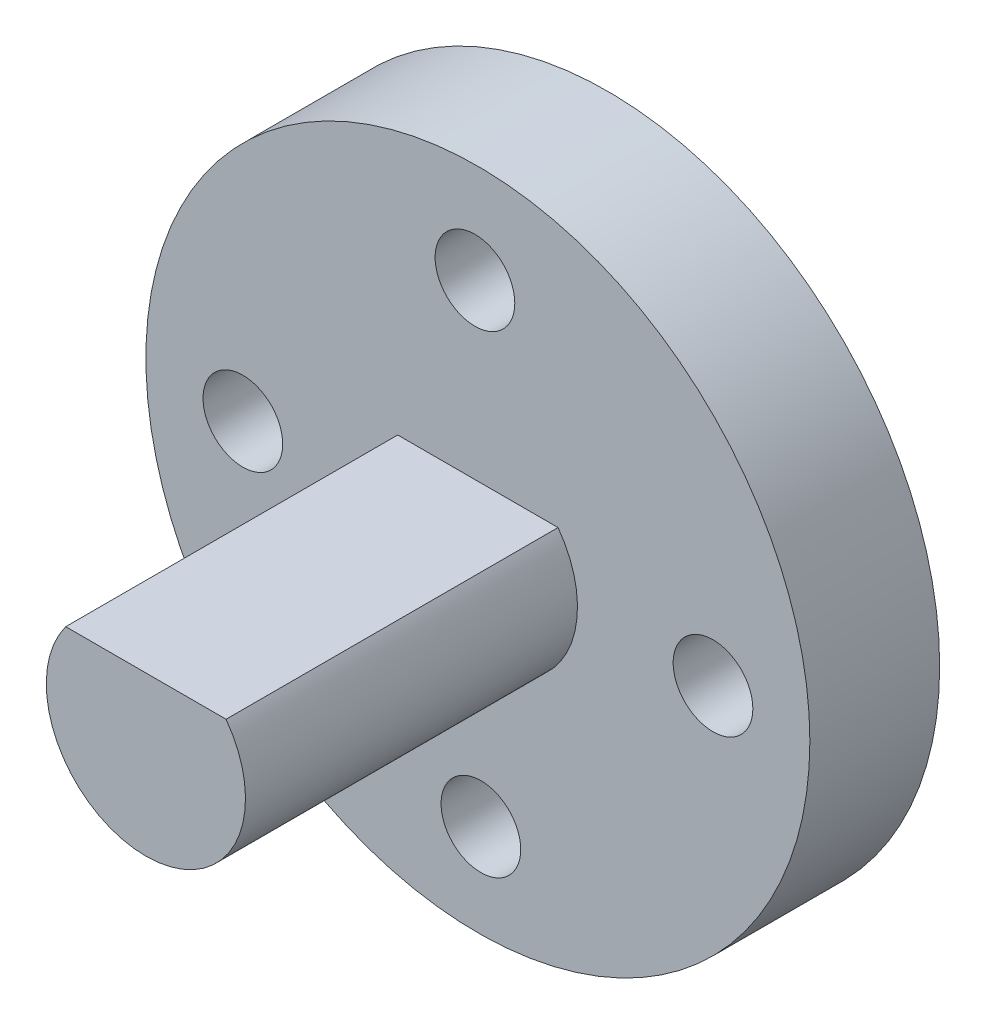
ISO-10303-21;
HEADER;
FILE_DESCRIPTION(('STEP AP214'),'2;1');
FILE_NAME('part.step','',(''),(''),'','','');
FILE_SCHEMA(('AUTOMOTIVE_DESIGN { 1 0 10303 214 1 1 1 1 }'));
ENDSEC;
DATA;
#1=APPLICATION_CONTEXT('core data for automotive mechanical design processes');
#2=APPLICATION_PROTOCOL_DEFINITION('international standard','automotive_design',2000,#1);
#3=PRODUCT_CONTEXT('',#1,'mechanical');
#4=PRODUCT('Part','Part','',(#3));
#5=PRODUCT_RELATED_PRODUCT_CATEGORY('part','',(#4));
#6=PRODUCT_DEFINITION_FORMATION('','',#4);
#7=PRODUCT_DEFINITION_CONTEXT('part definition',#1,'design');
#8=PRODUCT_DEFINITION('design','',#6,#7);
#9=PRODUCT_DEFINITION_SHAPE('','',#8);
#10=(LENGTH_UNIT() NAMED_UNIT(*) SI_UNIT(.MILLI.,.METRE.));
#11=(NAMED_UNIT(*) PLANE_ANGLE_UNIT() SI_UNIT($,.RADIAN.));
#12=(NAMED_UNIT(*) SI_UNIT($,.STERADIAN.) SOLID_ANGLE_UNIT());
#13=UNCERTAINTY_MEASURE_WITH_UNIT(LENGTH_MEASURE(1.E-05),#10,'distance_accuracy_value','');
#14=(GEOMETRIC_REPRESENTATION_CONTEXT(3) GLOBAL_UNCERTAINTY_ASSIGNED_CONTEXT((#13)) GLOBAL_UNIT_ASSIGNED_CONTEXT((#10,
#11,#12)) REPRESENTATION_CONTEXT('',''));
#15=CARTESIAN_POINT('',(0.,0.,0.));
#16=DIRECTION('',(0.,0.,1.));
#17=DIRECTION('',(1.,0.,0.));
#18=AXIS2_PLACEMENT_3D('',#15,#16,#17);
#19=CARTESIAN_POINT('',(0.,0.,3.91));
#20=DIRECTION('',(0.,0.,-1.));
#21=DIRECTION('',(-1.,0.,0.));
#22=AXIS2_PLACEMENT_3D('',#19,#20,#21);
#23=CYLINDRICAL_SURFACE('',#22,10.);
#24=CARTESIAN_POINT('',(0.,0.,3.91));
#25=DIRECTION('',(0.,0.,1.));
#26=DIRECTION('',(1.,0.,0.));
#27=AXIS2_PLACEMENT_3D('',#24,#25,#26);
#28=CIRCLE('',#27,10.);
#29=CARTESIAN_POINT('',(10.,0.,3.91));
#30=VERTEX_POINT('',#29);
#31=EDGE_CURVE('E42',#30,#30,#28,.T.);
#32=ORIENTED_EDGE('',*,*,#31,.F.);
#33=EDGE_LOOP('',(#32));
#34=FACE_BOUND('',#33,.T.);
#35=CARTESIAN_POINT('',(0.,0.,0.));
#36=DIRECTION('',(0.,0.,1.));
#37=DIRECTION('',(1.,0.,0.));
#38=AXIS2_PLACEMENT_3D('',#35,#36,#37);
#39=CIRCLE('',#38,10.);
#40=CARTESIAN_POINT('',(10.,0.,0.));
#41=VERTEX_POINT('',#40);
#42=EDGE_CURVE('E102',#41,#41,#39,.T.);
#43=ORIENTED_EDGE('',*,*,#42,.T.);
#44=EDGE_LOOP('',(#43));
#45=FACE_BOUND('',#44,.T.);
#46=ADVANCED_FACE('F35',(#34,#45),#23,.T.);
#47=CARTESIAN_POINT('',(0.,0.,3.91));
#48=DIRECTION('',(0.,0.,1.));
#49=DIRECTION('',(1.,0.,0.));
#50=AXIS2_PLACEMENT_3D('',#47,#48,#49);
#51=PLANE('',#50);
#52=CARTESIAN_POINT('',(0.,0.,3.91));
#53=DIRECTION('',(0.,0.,1.));
#54=DIRECTION('',(1.,0.,0.));
#55=AXIS2_PLACEMENT_3D('',#52,#53,#54);
#56=CIRCLE('',#55,3.);
#57=CARTESIAN_POINT('',(-2.41487059694717,1.78,3.91));
#58=VERTEX_POINT('',#57);
#59=CARTESIAN_POINT('',(2.41487059694717,1.78,3.91));
#60=VERTEX_POINT('',#59);
#61=EDGE_CURVE('E69',#58,#60,#56,.T.);
#62=ORIENTED_EDGE('',*,*,#61,.F.);
#63=DIRECTION('',(-1.,0.,0.));
#64=VECTOR('',#63,1.);
#65=CARTESIAN_POINT('',(-3.,1.78,3.91));
#66=LINE('',#65,#64);
#67=EDGE_CURVE('E59',#60,#58,#66,.T.);
#68=ORIENTED_EDGE('',*,*,#67,.F.);
#69=EDGE_LOOP('',(#62,#68));
#70=FACE_BOUND('',#69,.T.);
#71=CARTESIAN_POINT('',(7.08208613284244,-0.0123331323388329,3.91));
#72=DIRECTION('',(0.,0.,1.));
#73=DIRECTION('',(1.,0.,0.));
#74=AXIS2_PLACEMENT_3D('',#71,#72,#73);
#75=CIRCLE('',#74,1.2);
#76=CARTESIAN_POINT('',(8.28208613284244,-0.0123331323388329,3.91));
#77=VERTEX_POINT('',#76);
#78=EDGE_CURVE('E75',#77,#77,#75,.T.);
#79=ORIENTED_EDGE('',*,*,#78,.F.);
#80=EDGE_LOOP('',(#79));
#81=FACE_BOUND('',#80,.T.);
#82=CARTESIAN_POINT('',(0.0909209988705227,-7.18275891077163,3.91));
#83=DIRECTION('',(0.,0.,1.));
#84=DIRECTION('',(1.,0.,0.));
#85=AXIS2_PLACEMENT_3D('',#82,#83,#84);
#86=CIRCLE('',#85,1.2);
#87=CARTESIAN_POINT('',(1.29092099887052,-7.18275891077163,3.91));
#88=VERTEX_POINT('',#87);
#89=EDGE_CURVE('E84',#88,#88,#86,.T.);
#90=ORIENTED_EDGE('',*,*,#89,.F.);
#91=EDGE_LOOP('',(#90));
#92=FACE_BOUND('',#91,.T.);
#93=CARTESIAN_POINT('',(-7.07950477956221,-0.191593776799744,3.91));
#94=DIRECTION('',(0.,0.,1.));
#95=DIRECTION('',(1.,0.,0.));
#96=AXIS2_PLACEMENT_3D('',#93,#94,#95);
#97=CIRCLE('',#96,1.2);
#98=CARTESIAN_POINT('',(-5.87950477956221,-0.191593776799744,3.91));
#99=VERTEX_POINT('',#98);
#100=EDGE_CURVE('E90',#99,#99,#97,.T.);
#101=ORIENTED_EDGE('',*,*,#100,.F.);
#102=EDGE_LOOP('',(#101));
#103=FACE_BOUND('',#102,.T.);
#104=CARTESIAN_POINT('',(-0.0883396455902898,6.97883200163301,3.91));
#105=DIRECTION('',(0.,0.,1.));
#106=DIRECTION('',(1.,0.,0.));
#107=AXIS2_PLACEMENT_3D('',#104,#105,#106);
#108=CIRCLE('',#107,1.2);
#109=CARTESIAN_POINT('',(1.11166035440971,6.97883200163301,3.91));
#110=VERTEX_POINT('',#109);
#111=EDGE_CURVE('E96',#110,#110,#108,.T.);
#112=ORIENTED_EDGE('',*,*,#111,.F.);
#113=EDGE_LOOP('',(#112));
#114=FACE_BOUND('',#113,.T.);
#115=ORIENTED_EDGE('',*,*,#31,.T.);
#116=EDGE_LOOP('',(#115));
#117=FACE_BOUND('',#116,.T.);
#118=ADVANCED_FACE('F67',(#70,#81,#92,#103,#114,#117),#51,.T.);
#119=CARTESIAN_POINT('',(0.,0.,0.));
#120=DIRECTION('',(0.,0.,1.));
#121=DIRECTION('',(1.,0.,0.));
#122=AXIS2_PLACEMENT_3D('',#119,#120,#121);
#123=PLANE('',#122);
#124=CARTESIAN_POINT('',(0.,0.,0.));
#125=DIRECTION('',(0.,0.,-1.));
#126=DIRECTION('',(-1.,0.,0.));
#127=AXIS2_PLACEMENT_3D('',#124,#125,#126);
#128=CIRCLE('',#127,4.);
#129=CARTESIAN_POINT('',(-4.,0.,0.));
#130=VERTEX_POINT('',#129);
#131=EDGE_CURVE('E242',#130,#130,#128,.T.);
#132=ORIENTED_EDGE('',*,*,#131,.F.);
#133=EDGE_LOOP('',(#132));
#134=FACE_BOUND('',#133,.T.);
#135=CARTESIAN_POINT('',(7.08208613284244,-0.0123331323388329,0.));
#136=DIRECTION('',(0.,0.,1.));
#137=DIRECTION('',(1.,0.,0.));
#138=AXIS2_PLACEMENT_3D('',#135,#136,#137);
#139=CIRCLE('',#138,1.2);
#140=CARTESIAN_POINT('',(8.28208613284244,-0.0123331323388329,0.));
#141=VERTEX_POINT('',#140);
#142=EDGE_CURVE('E81',#141,#141,#139,.T.);
#143=ORIENTED_EDGE('',*,*,#142,.T.);
#144=EDGE_LOOP('',(#143));
#145=FACE_BOUND('',#144,.T.);
#146=CARTESIAN_POINT('',(0.0909209988705227,-7.18275891077163,0.));
#147=DIRECTION('',(0.,0.,1.));
#148=DIRECTION('',(1.,0.,0.));
#149=AXIS2_PLACEMENT_3D('',#146,#147,#148);
#150=CIRCLE('',#149,1.2);
#151=CARTESIAN_POINT('',(1.29092099887052,-7.18275891077163,0.));
#152=VERTEX_POINT('',#151);
#153=EDGE_CURVE('E87',#152,#152,#150,.T.);
#154=ORIENTED_EDGE('',*,*,#153,.T.);
#155=EDGE_LOOP('',(#154));
#156=FACE_BOUND('',#155,.T.);
#157=CARTESIAN_POINT('',(-7.07950477956221,-0.191593776799744,0.));
#158=DIRECTION('',(0.,0.,1.));
#159=DIRECTION('',(1.,0.,0.));
#160=AXIS2_PLACEMENT_3D('',#157,#158,#159);
#161=CIRCLE('',#160,1.2);
#162=CARTESIAN_POINT('',(-5.87950477956221,-0.191593776799744,0.));
#163=VERTEX_POINT('',#162);
#164=EDGE_CURVE('E93',#163,#163,#161,.T.);
#165=ORIENTED_EDGE('',*,*,#164,.T.);
#166=EDGE_LOOP('',(#165));
#167=FACE_BOUND('',#166,.T.);
#168=CARTESIAN_POINT('',(-0.0883396455902898,6.97883200163301,0.));
#169=DIRECTION('',(0.,0.,1.));
#170=DIRECTION('',(1.,0.,0.));
#171=AXIS2_PLACEMENT_3D('',#168,#169,#170);
#172=CIRCLE('',#171,1.2);
#173=CARTESIAN_POINT('',(1.11166035440971,6.97883200163301,0.));
#174=VERTEX_POINT('',#173);
#175=EDGE_CURVE('E99',#174,#174,#172,.T.);
#176=ORIENTED_EDGE('',*,*,#175,.T.);
#177=EDGE_LOOP('',(#176));
#178=FACE_BOUND('',#177,.T.);
#179=ORIENTED_EDGE('',*,*,#42,.F.);
#180=EDGE_LOOP('',(#179));
#181=FACE_BOUND('',#180,.T.);
#182=ADVANCED_FACE('F108',(#134,#145,#156,#167,#178,#181),#123,.F.);
#183=CARTESIAN_POINT('',(-0.0883396455902898,6.97883200163301,3.91));
#184=DIRECTION('',(0.,0.,1.));
#185=DIRECTION('',(1.,0.,0.));
#186=AXIS2_PLACEMENT_3D('',#183,#184,#185);
#187=CYLINDRICAL_SURFACE('',#186,1.2);
#188=ORIENTED_EDGE('',*,*,#175,.F.);
#189=EDGE_LOOP('',(#188));
#190=FACE_BOUND('',#189,.T.);
#191=ORIENTED_EDGE('',*,*,#111,.T.);
#192=EDGE_LOOP('',(#191));
#193=FACE_BOUND('',#192,.T.);
#194=ADVANCED_FACE('F110',(#190,#193),#187,.F.);
#195=CARTESIAN_POINT('',(-7.07950477956221,-0.191593776799744,3.91));
#196=DIRECTION('',(0.,0.,1.));
#197=DIRECTION('',(1.,0.,0.));
#198=AXIS2_PLACEMENT_3D('',#195,#196,#197);
#199=CYLINDRICAL_SURFACE('',#198,1.2);
#200=ORIENTED_EDGE('',*,*,#164,.F.);
#201=EDGE_LOOP('',(#200));
#202=FACE_BOUND('',#201,.T.);
#203=ORIENTED_EDGE('',*,*,#100,.T.);
#204=EDGE_LOOP('',(#203));
#205=FACE_BOUND('',#204,.T.);
#206=ADVANCED_FACE('F116',(#202,#205),#199,.F.);
#207=CARTESIAN_POINT('',(0.0909209988705227,-7.18275891077163,3.91));
#208=DIRECTION('',(0.,0.,1.));
#209=DIRECTION('',(1.,0.,0.));
#210=AXIS2_PLACEMENT_3D('',#207,#208,#209);
#211=CYLINDRICAL_SURFACE('',#210,1.2);
#212=ORIENTED_EDGE('',*,*,#153,.F.);
#213=EDGE_LOOP('',(#212));
#214=FACE_BOUND('',#213,.T.);
#215=ORIENTED_EDGE('',*,*,#89,.T.);
#216=EDGE_LOOP('',(#215));
#217=FACE_BOUND('',#216,.T.);
#218=ADVANCED_FACE('F198',(#214,#217),#211,.F.);
#219=CARTESIAN_POINT('',(7.08208613284244,-0.0123331323388329,3.91));
#220=DIRECTION('',(0.,0.,1.));
#221=DIRECTION('',(1.,0.,0.));
#222=AXIS2_PLACEMENT_3D('',#219,#220,#221);
#223=CYLINDRICAL_SURFACE('',#222,1.2);
#224=ORIENTED_EDGE('',*,*,#142,.F.);
#225=EDGE_LOOP('',(#224));
#226=FACE_BOUND('',#225,.T.);
#227=ORIENTED_EDGE('',*,*,#78,.T.);
#228=EDGE_LOOP('',(#227));
#229=FACE_BOUND('',#228,.T.);
#230=ADVANCED_FACE('F142',(#226,#229),#223,.F.);
#231=CARTESIAN_POINT('',(0.,0.,13.91));
#232=DIRECTION('',(0.,0.,-1.));
#233=DIRECTION('',(-1.,0.,0.));
#234=AXIS2_PLACEMENT_3D('',#231,#232,#233);
#235=CYLINDRICAL_SURFACE('',#234,3.);
#236=CARTESIAN_POINT('',(0.,0.,13.91));
#237=DIRECTION('',(0.,0.,1.));
#238=DIRECTION('',(1.,0.,0.));
#239=AXIS2_PLACEMENT_3D('',#236,#237,#238);
#240=CIRCLE('',#239,3.);
#241=CARTESIAN_POINT('',(-2.41487059694717,1.78,13.91));
#242=VERTEX_POINT('',#241);
#243=CARTESIAN_POINT('',(2.41487059694717,1.78,13.91));
#244=VERTEX_POINT('',#243);
#245=EDGE_CURVE('E73',#242,#244,#240,.T.);
#246=ORIENTED_EDGE('',*,*,#245,.F.);
#247=DIRECTION('',(0.,0.,-1.));
#248=VECTOR('',#247,1.);
#249=CARTESIAN_POINT('',(-2.41487059694717,1.78,13.91));
#250=LINE('',#249,#248);
#251=EDGE_CURVE('E48',#242,#58,#250,.T.);
#252=ORIENTED_EDGE('',*,*,#251,.T.);
#253=ORIENTED_EDGE('',*,*,#61,.T.);
#254=DIRECTION('',(0.,0.,-1.));
#255=VECTOR('',#254,1.);
#256=CARTESIAN_POINT('',(2.41487059694717,1.78,13.91));
#257=LINE('',#256,#255);
#258=EDGE_CURVE('E56',#60,#244,#257,.F.);
#259=ORIENTED_EDGE('',*,*,#258,.T.);
#260=EDGE_LOOP('',(#246,#252,#253,#259));
#261=FACE_BOUND('',#260,.T.);
#262=ADVANCED_FACE('F72',(#261),#235,.T.);
#263=CARTESIAN_POINT('',(0.,0.,13.91));
#264=DIRECTION('',(0.,0.,1.));
#265=DIRECTION('',(1.,0.,0.));
#266=AXIS2_PLACEMENT_3D('',#263,#264,#265);
#267=PLANE('',#266);
#268=DIRECTION('',(1.,0.,0.));
#269=VECTOR('',#268,1.);
#270=CARTESIAN_POINT('',(0.,1.78,13.91));
#271=LINE('',#270,#269);
#272=EDGE_CURVE('E11',#242,#244,#271,.T.);
#273=ORIENTED_EDGE('',*,*,#272,.F.);
#274=ORIENTED_EDGE('',*,*,#245,.T.);
#275=EDGE_LOOP('',(#273,#274));
#276=FACE_BOUND('',#275,.T.);
#277=ADVANCED_FACE('F151',(#276),#267,.T.);
#278=CARTESIAN_POINT('',(-3.,1.78,-2.21277714766755));
#279=DIRECTION('',(0.,-1.,0.));
#280=DIRECTION('',(0.,0.,-1.));
#281=AXIS2_PLACEMENT_3D('',#278,#279,#280);
#282=PLANE('',#281);
#283=ORIENTED_EDGE('',*,*,#272,.T.);
#284=ORIENTED_EDGE('',*,*,#258,.F.);
#285=ORIENTED_EDGE('',*,*,#67,.T.);
#286=ORIENTED_EDGE('',*,*,#251,.F.);
#287=EDGE_LOOP('',(#283,#284,#285,#286));
#288=FACE_BOUND('',#287,.T.);
#289=ADVANCED_FACE('F58',(#288),#282,.F.);
#290=CARTESIAN_POINT('',(0.,0.,1.91));
#291=DIRECTION('',(0.,0.,-1.));
#292=DIRECTION('',(-1.,0.,0.));
#293=AXIS2_PLACEMENT_3D('',#290,#291,#292);
#294=CYLINDRICAL_SURFACE('',#293,4.);
#295=CARTESIAN_POINT('',(0.,0.,1.91));
#296=DIRECTION('',(0.,0.,-1.));
#297=DIRECTION('',(-1.,0.,0.));
#298=AXIS2_PLACEMENT_3D('',#295,#296,#297);
#299=CIRCLE('',#298,4.);
#300=CARTESIAN_POINT('',(-4.,0.,1.91));
#301=VERTEX_POINT('',#300);
#302=EDGE_CURVE('E70',#301,#301,#299,.T.);
#303=CARTESIAN_POINT('',(-4.,0.,1.91));
#304=CARTESIAN_POINT('',(-4.,0.,1.89010416666667));
#305=CARTESIAN_POINT('',(-4.,0.,1.87020833333333));
#306=CARTESIAN_POINT('',(-4.,0.,1.83041666666667));
#307=CARTESIAN_POINT('',(-4.,0.,1.81052083333333));
#308=CARTESIAN_POINT('',(-4.,0.,1.77072916666667));
#309=CARTESIAN_POINT('',(-4.,0.,1.75083333333333));
#310=CARTESIAN_POINT('',(-4.,0.,1.71104166666667));
#311=CARTESIAN_POINT('',(-4.,0.,1.69114583333333));
#312=CARTESIAN_POINT('',(-4.,0.,1.65135416666667));
#313=CARTESIAN_POINT('',(-4.,0.,1.63145833333333));
#314=CARTESIAN_POINT('',(-4.,0.,1.59166666666667));
#315=CARTESIAN_POINT('',(-4.,0.,1.57177083333333));
#316=CARTESIAN_POINT('',(-4.,0.,1.53197916666667));
#317=CARTESIAN_POINT('',(-4.,0.,1.51208333333333));
#318=CARTESIAN_POINT('',(-4.,0.,1.47229166666667));
#319=CARTESIAN_POINT('',(-4.,0.,1.45239583333333));
#320=CARTESIAN_POINT('',(-4.,0.,1.41260416666667));
#321=CARTESIAN_POINT('',(-4.,0.,1.39270833333333));
#322=CARTESIAN_POINT('',(-4.,0.,1.35291666666667));
#323=CARTESIAN_POINT('',(-4.,0.,1.33302083333333));
#324=CARTESIAN_POINT('',(-4.,0.,1.29322916666667));
#325=CARTESIAN_POINT('',(-4.,0.,1.27333333333333));
#326=CARTESIAN_POINT('',(-4.,0.,1.23354166666667));
#327=CARTESIAN_POINT('',(-4.,0.,1.21364583333333));
#328=CARTESIAN_POINT('',(-4.,0.,1.17385416666667));
#329=CARTESIAN_POINT('',(-4.,0.,1.15395833333333));
#330=CARTESIAN_POINT('',(-4.,0.,1.11416666666667));
#331=CARTESIAN_POINT('',(-4.,0.,1.09427083333333));
#332=CARTESIAN_POINT('',(-4.,0.,1.05447916666667));
#333=CARTESIAN_POINT('',(-4.,0.,1.03458333333333));
#334=CARTESIAN_POINT('',(-4.,0.,0.994791666666667));
#335=CARTESIAN_POINT('',(-4.,0.,0.974895833333334));
#336=CARTESIAN_POINT('',(-4.,0.,0.935104166666667));
#337=CARTESIAN_POINT('',(-4.,0.,0.915208333333333));
#338=CARTESIAN_POINT('',(-4.,0.,0.875416666666667));
#339=CARTESIAN_POINT('',(-4.,0.,0.855520833333333));
#340=CARTESIAN_POINT('',(-4.,0.,0.815729166666667));
#341=CARTESIAN_POINT('',(-4.,0.,0.795833333333333));
#342=CARTESIAN_POINT('',(-4.,0.,0.756041666666667));
#343=CARTESIAN_POINT('',(-4.,0.,0.736145833333333));
#344=CARTESIAN_POINT('',(-4.,0.,0.696354166666667));
#345=CARTESIAN_POINT('',(-4.,0.,0.676458333333333));
#346=CARTESIAN_POINT('',(-4.,0.,0.636666666666667));
#347=CARTESIAN_POINT('',(-4.,0.,0.616770833333333));
#348=CARTESIAN_POINT('',(-4.,0.,0.576979166666667));
#349=CARTESIAN_POINT('',(-4.,0.,0.557083333333333));
#350=CARTESIAN_POINT('',(-4.,0.,0.517291666666667));
#351=CARTESIAN_POINT('',(-4.,0.,0.497395833333333));
#352=CARTESIAN_POINT('',(-4.,0.,0.457604166666667));
#353=CARTESIAN_POINT('',(-4.,0.,0.437708333333333));
#354=CARTESIAN_POINT('',(-4.,0.,0.397916666666667));
#355=CARTESIAN_POINT('',(-4.,0.,0.378020833333333));
#356=CARTESIAN_POINT('',(-4.,0.,0.338229166666667));
#357=CARTESIAN_POINT('',(-4.,0.,0.318333333333333));
#358=CARTESIAN_POINT('',(-4.,0.,0.278541666666667));
#359=CARTESIAN_POINT('',(-4.,0.,0.258645833333333));
#360=CARTESIAN_POINT('',(-4.,0.,0.218854166666667));
#361=CARTESIAN_POINT('',(-4.,0.,0.198958333333333));
#362=CARTESIAN_POINT('',(-4.,0.,0.159166666666667));
#363=CARTESIAN_POINT('',(-4.,0.,0.139270833333333));
#364=CARTESIAN_POINT('',(-4.,0.,0.0994791666666668));
#365=CARTESIAN_POINT('',(-4.,0.,0.0795833333333334));
#366=CARTESIAN_POINT('',(-4.,0.,0.0397916666666667));
#367=CARTESIAN_POINT('',(-4.,0.,0.0198958333333334));
#368=CARTESIAN_POINT('',(-4.,0.,0.));
#369=B_SPLINE_CURVE_WITH_KNOTS('',3,(#303,#304,#305,#306,#307,#308,#309,#310,#311,#312,#313,
#314,#315,#316,#317,#318,#319,#320,#321,#322,#323,#324,#325,#326,#327,#328,#329,#330,#331,#332,
#333,#334,#335,#336,#337,#338,#339,#340,#341,#342,#343,#344,#345,#346,#347,#348,#349,#350,#351,
#352,#353,#354,#355,#356,#357,#358,#359,#360,#361,#362,#363,#364,#365,#366,#367,#368),
.UNSPECIFIED.,.F.,.F.,(4,2,2,2,2,2,2,2,2,2,2,2,2,2,2,2,2,2,2,2,2,2,2,2,2,2,2,2,2,2,2,2,4),(0.,
0.0596874999999998,0.119375,0.1790625,0.23875,0.2984375,0.358125,0.4178125,0.4775,0.5371875,
0.596875,0.6565625,0.71625,0.7759375,0.835625,0.8953125,0.955,1.0146875,1.074375,1.1340625,
1.19375,1.2534375,1.313125,1.3728125,1.4325,1.4921875,1.551875,1.6115625,1.67125,1.7309375,
1.790625,1.8503125,1.91),.UNSPECIFIED.);
#370=EDGE_CURVE('BSEAM166',#301,#130,#369,.T.);
#371=ORIENTED_EDGE('',*,*,#302,.F.);
#372=ORIENTED_EDGE('',*,*,#131,.T.);
#373=ORIENTED_EDGE('',*,*,#370,.T.);
#374=ORIENTED_EDGE('',*,*,#370,.F.);
#375=EDGE_LOOP('',(#371,#373,#372,#374));
#376=FACE_BOUND('',#375,.T.);
#377=ADVANCED_FACE('F166',(#376),#294,.F.);
#378=CARTESIAN_POINT('',(0.,0.,1.91));
#379=DIRECTION('',(0.,0.,-1.));
#380=DIRECTION('',(-1.,0.,0.));
#381=AXIS2_PLACEMENT_3D('',#378,#379,#380);
#382=PLANE('',#381);
#383=ORIENTED_EDGE('',*,*,#302,.T.);
#384=EDGE_LOOP('',(#383));
#385=FACE_BOUND('',#384,.T.);
#386=ADVANCED_FACE('F181',(#385),#382,.T.);
#387=CLOSED_SHELL('',(#46,#118,#182,#194,#206,#218,#230,#262,#277,#289,#377,#386));
#388=MANIFOLD_SOLID_BREP('B2',#387);
#389=ADVANCED_BREP_SHAPE_REPRESENTATION('',(#18,#388),#14);
#390=SHAPE_DEFINITION_REPRESENTATION(#9,#389);
ENDSEC;
END-ISO-10303-21;
